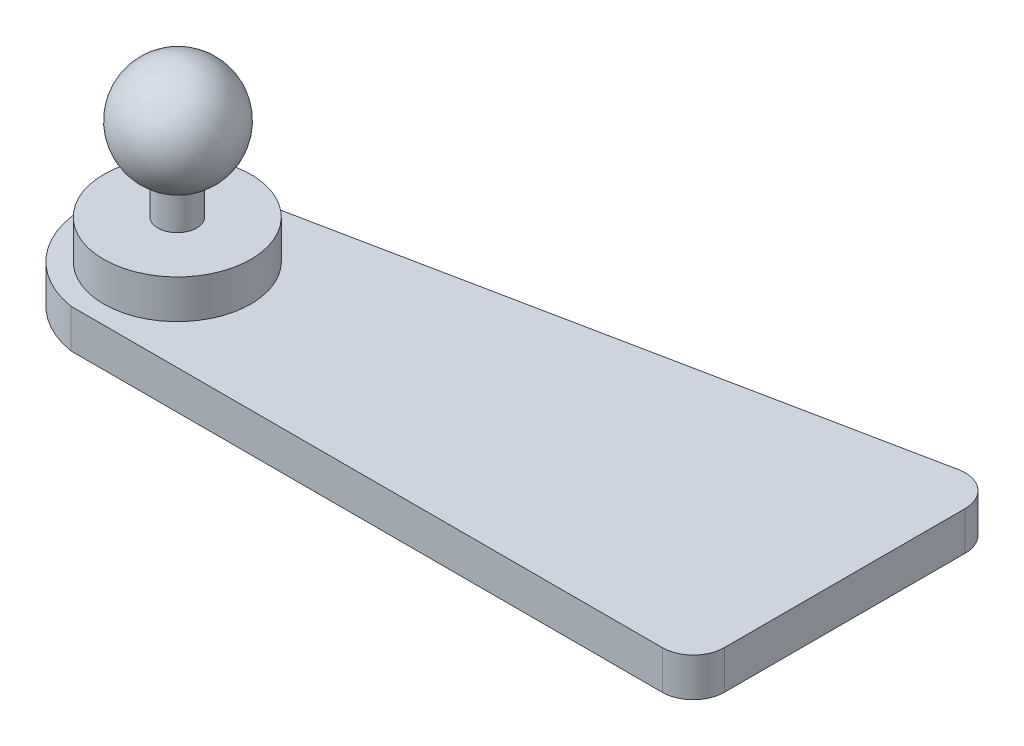
ISO-10303-21;
HEADER;
FILE_DESCRIPTION(('STEP AP214'),'2;1');
FILE_NAME('part.step','',(''),(''),'','','');
FILE_SCHEMA(('AUTOMOTIVE_DESIGN { 1 0 10303 214 1 1 1 1 }'));
ENDSEC;
DATA;
#1=APPLICATION_CONTEXT('core data for automotive mechanical design processes');
#2=APPLICATION_PROTOCOL_DEFINITION('international standard','automotive_design',2000,#1);
#3=PRODUCT_CONTEXT('',#1,'mechanical');
#4=PRODUCT('Part','Part','',(#3));
#5=PRODUCT_RELATED_PRODUCT_CATEGORY('part','',(#4));
#6=PRODUCT_DEFINITION_FORMATION('','',#4);
#7=PRODUCT_DEFINITION_CONTEXT('part definition',#1,'design');
#8=PRODUCT_DEFINITION('design','',#6,#7);
#9=PRODUCT_DEFINITION_SHAPE('','',#8);
#10=(LENGTH_UNIT() NAMED_UNIT(*) SI_UNIT(.MILLI.,.METRE.));
#11=(NAMED_UNIT(*) PLANE_ANGLE_UNIT() SI_UNIT($,.RADIAN.));
#12=(NAMED_UNIT(*) SI_UNIT($,.STERADIAN.) SOLID_ANGLE_UNIT());
#13=UNCERTAINTY_MEASURE_WITH_UNIT(LENGTH_MEASURE(1.E-05),#10,'distance_accuracy_value','');
#14=(GEOMETRIC_REPRESENTATION_CONTEXT(3) GLOBAL_UNCERTAINTY_ASSIGNED_CONTEXT((#13)) GLOBAL_UNIT_ASSIGNED_CONTEXT((#10,
#11,#12)) REPRESENTATION_CONTEXT('',''));
#15=CARTESIAN_POINT('',(0.,0.,0.));
#16=DIRECTION('',(0.,0.,1.));
#17=DIRECTION('',(1.,0.,0.));
#18=AXIS2_PLACEMENT_3D('',#15,#16,#17);
#19=CARTESIAN_POINT('',(51.0268301177277,3.175,0.));
#20=DIRECTION('',(-1.,0.,0.));
#21=DIRECTION('',(0.,0.,1.));
#22=AXIS2_PLACEMENT_3D('',#19,#20,#21);
#23=PLANE('',#22);
#24=DIRECTION('',(0.,0.,-1.));
#25=VECTOR('',#24,1.);
#26=CARTESIAN_POINT('',(51.0268301177277,0.,0.));
#27=LINE('',#26,#25);
#28=CARTESIAN_POINT('',(51.0268301177277,0.,-2.54));
#29=VERTEX_POINT('',#28);
#30=CARTESIAN_POINT('',(51.0268301177277,0.,-22.2936444696328));
#31=VERTEX_POINT('',#30);
#32=EDGE_CURVE('E131',#29,#31,#27,.T.);
#33=ORIENTED_EDGE('',*,*,#32,.T.);
#34=DIRECTION('',(0.,-1.,0.));
#35=VECTOR('',#34,1.);
#36=CARTESIAN_POINT('',(51.0268301177277,3.175,-22.2936444696328));
#37=LINE('',#36,#35);
#38=CARTESIAN_POINT('',(51.0268301177277,3.175,-22.2936444696328));
#39=VERTEX_POINT('',#38);
#40=EDGE_CURVE('E64',#31,#39,#37,.F.);
#41=ORIENTED_EDGE('',*,*,#40,.T.);
#42=DIRECTION('',(0.,0.,-1.));
#43=VECTOR('',#42,1.);
#44=CARTESIAN_POINT('',(51.0268301177277,3.175,0.));
#45=LINE('',#44,#43);
#46=CARTESIAN_POINT('',(51.0268301177277,3.175,-2.54));
#47=VERTEX_POINT('',#46);
#48=EDGE_CURVE('E108',#47,#39,#45,.T.);
#49=ORIENTED_EDGE('',*,*,#48,.F.);
#50=DIRECTION('',(0.,-1.,0.));
#51=VECTOR('',#50,1.);
#52=CARTESIAN_POINT('',(51.0268301177277,3.175,-2.54));
#53=LINE('',#52,#51);
#54=EDGE_CURVE('E224',#47,#29,#53,.T.);
#55=ORIENTED_EDGE('',*,*,#54,.T.);
#56=EDGE_LOOP('',(#33,#41,#49,#55));
#57=FACE_BOUND('',#56,.T.);
#58=ADVANCED_FACE('F42',(#57),#23,.F.);
#59=CARTESIAN_POINT('',(51.0268301177277,3.175,-25.4));
#60=DIRECTION('',(0.198611005955893,0.,0.980078399064681));
#61=DIRECTION('',(0.980078399064681,0.,-0.198611005955893));
#62=AXIS2_PLACEMENT_3D('',#59,#60,#61);
#63=PLANE('',#62);
#64=DIRECTION('',(-0.980078399064681,0.,0.198611005955893));
#65=VECTOR('',#64,1.);
#66=CARTESIAN_POINT('',(51.0268301177277,3.175,-25.4));
#67=LINE('',#66,#65);
#68=CARTESIAN_POINT('',(47.9823581625998,3.175,-24.7830436032571));
#69=VERTEX_POINT('',#68);
#70=CARTESIAN_POINT('',(-0.321385747656168,3.175,-14.9943826363311));
#71=VERTEX_POINT('',#70);
#72=EDGE_CURVE('E97',#69,#71,#67,.T.);
#73=ORIENTED_EDGE('',*,*,#72,.F.);
#74=DIRECTION('',(0.,-1.,0.));
#75=VECTOR('',#74,1.);
#76=CARTESIAN_POINT('',(47.9823581625998,3.175,-24.7830436032571));
#77=LINE('',#76,#75);
#78=CARTESIAN_POINT('',(47.9823581625998,0.,-24.7830436032571));
#79=VERTEX_POINT('',#78);
#80=EDGE_CURVE('E155',#69,#79,#77,.T.);
#81=ORIENTED_EDGE('',*,*,#80,.T.);
#82=DIRECTION('',(-0.980078399064681,0.,0.198611005955893));
#83=VECTOR('',#82,1.);
#84=CARTESIAN_POINT('',(51.0268301177277,0.,-25.4));
#85=LINE('',#84,#83);
#86=CARTESIAN_POINT('',(-0.321385747656168,0.,-14.9943826363311));
#87=VERTEX_POINT('',#86);
#88=EDGE_CURVE('E114',#79,#87,#85,.T.);
#89=ORIENTED_EDGE('',*,*,#88,.T.);
#90=DIRECTION('',(0.,-1.,0.));
#91=VECTOR('',#90,1.);
#92=CARTESIAN_POINT('',(-0.321385747656168,3.175,-14.9943826363311));
#93=LINE('',#92,#91);
#94=EDGE_CURVE('E111',#71,#87,#93,.T.);
#95=ORIENTED_EDGE('',*,*,#94,.F.);
#96=EDGE_LOOP('',(#73,#81,#89,#95));
#97=FACE_BOUND('',#96,.T.);
#98=ADVANCED_FACE('F112',(#97),#63,.F.);
#99=CARTESIAN_POINT('',(1.19203011772773,3.175,-7.52618523545827));
#100=DIRECTION('',(0.,-1.,0.));
#101=DIRECTION('',(0.,0.,-1.));
#102=AXIS2_PLACEMENT_3D('',#99,#100,#101);
#103=CYLINDRICAL_SURFACE('',#102,7.62);
#104=CARTESIAN_POINT('',(1.19203011772773,0.,-7.52618523545827));
#105=DIRECTION('',(0.,1.,0.));
#106=DIRECTION('',(0.,0.,1.));
#107=AXIS2_PLACEMENT_3D('',#104,#105,#106);
#108=CIRCLE('',#107,7.62);
#109=CARTESIAN_POINT('',(0.,0.,0.));
#110=VERTEX_POINT('',#109);
#111=EDGE_CURVE('E137',#87,#110,#108,.T.);
#112=ORIENTED_EDGE('',*,*,#111,.T.);
#113=DIRECTION('',(0.,-1.,0.));
#114=VECTOR('',#113,1.);
#115=CARTESIAN_POINT('',(0.,3.175,0.));
#116=LINE('',#115,#114);
#117=CARTESIAN_POINT('',(0.,3.175,0.));
#118=VERTEX_POINT('',#117);
#119=EDGE_CURVE('E119',#118,#110,#116,.T.);
#120=ORIENTED_EDGE('',*,*,#119,.F.);
#121=CARTESIAN_POINT('',(1.19203011772773,3.175,-7.52618523545827));
#122=DIRECTION('',(0.,1.,0.));
#123=DIRECTION('',(0.,0.,1.));
#124=AXIS2_PLACEMENT_3D('',#121,#122,#123);
#125=CIRCLE('',#124,7.62);
#126=EDGE_CURVE('E101',#71,#118,#125,.T.);
#127=ORIENTED_EDGE('',*,*,#126,.F.);
#128=ORIENTED_EDGE('',*,*,#94,.T.);
#129=EDGE_LOOP('',(#112,#120,#127,#128));
#130=FACE_BOUND('',#129,.T.);
#131=ADVANCED_FACE('F121',(#130),#103,.T.);
#132=CARTESIAN_POINT('',(0.,3.175,0.));
#133=DIRECTION('',(0.,0.,-1.));
#134=DIRECTION('',(-1.,0.,0.));
#135=AXIS2_PLACEMENT_3D('',#132,#133,#134);
#136=PLANE('',#135);
#137=DIRECTION('',(1.,0.,0.));
#138=VECTOR('',#137,1.);
#139=CARTESIAN_POINT('',(0.,0.,0.));
#140=LINE('',#139,#138);
#141=CARTESIAN_POINT('',(48.4868301177277,0.,0.));
#142=VERTEX_POINT('',#141);
#143=EDGE_CURVE('E140',#110,#142,#140,.T.);
#144=ORIENTED_EDGE('',*,*,#143,.T.);
#145=DIRECTION('',(0.,-1.,0.));
#146=VECTOR('',#145,1.);
#147=CARTESIAN_POINT('',(48.4868301177277,3.175,0.));
#148=LINE('',#147,#146);
#149=CARTESIAN_POINT('',(48.4868301177277,3.175,0.));
#150=VERTEX_POINT('',#149);
#151=EDGE_CURVE('E11',#142,#150,#148,.F.);
#152=ORIENTED_EDGE('',*,*,#151,.T.);
#153=DIRECTION('',(1.,0.,0.));
#154=VECTOR('',#153,1.);
#155=CARTESIAN_POINT('',(0.,3.175,0.));
#156=LINE('',#155,#154);
#157=EDGE_CURVE('E124',#118,#150,#156,.T.);
#158=ORIENTED_EDGE('',*,*,#157,.F.);
#159=ORIENTED_EDGE('',*,*,#119,.T.);
#160=EDGE_LOOP('',(#144,#152,#158,#159));
#161=FACE_BOUND('',#160,.T.);
#162=ADVANCED_FACE('F182',(#161),#136,.F.);
#163=CARTESIAN_POINT('',(1.19203011772773,3.175,-7.52618523545827));
#164=DIRECTION('',(0.,1.,0.));
#165=DIRECTION('',(0.,0.,1.));
#166=AXIS2_PLACEMENT_3D('',#163,#164,#165);
#167=PLANE('',#166);
#168=CARTESIAN_POINT('',(1.19203011772773,3.175,-7.52618523545827));
#169=DIRECTION('',(0.,1.,0.));
#170=DIRECTION('',(0.,0.,1.));
#171=AXIS2_PLACEMENT_3D('',#168,#169,#170);
#172=CIRCLE('',#171,6.0325);
#173=CARTESIAN_POINT('',(1.19203011772773,3.175,-1.49368523545827));
#174=VERTEX_POINT('',#173);
#175=EDGE_CURVE('E154',#174,#174,#172,.T.);
#176=ORIENTED_EDGE('',*,*,#175,.F.);
#177=EDGE_LOOP('',(#176));
#178=FACE_BOUND('',#177,.T.);
#179=ORIENTED_EDGE('',*,*,#48,.T.);
#180=CARTESIAN_POINT('',(48.4868301177277,3.175,-22.2936444696328));
#181=DIRECTION('',(0.,1.,0.));
#182=DIRECTION('',(0.,0.,1.));
#183=AXIS2_PLACEMENT_3D('',#180,#181,#182);
#184=CIRCLE('',#183,2.54);
#185=EDGE_CURVE('E51',#39,#69,#184,.T.);
#186=ORIENTED_EDGE('',*,*,#185,.T.);
#187=ORIENTED_EDGE('',*,*,#72,.T.);
#188=ORIENTED_EDGE('',*,*,#126,.T.);
#189=ORIENTED_EDGE('',*,*,#157,.T.);
#190=CARTESIAN_POINT('',(48.4868301177277,3.175,-2.54));
#191=DIRECTION('',(0.,1.,0.));
#192=DIRECTION('',(0.,0.,1.));
#193=AXIS2_PLACEMENT_3D('',#190,#191,#192);
#194=CIRCLE('',#193,2.54);
#195=EDGE_CURVE('E214',#150,#47,#194,.T.);
#196=ORIENTED_EDGE('',*,*,#195,.T.);
#197=EDGE_LOOP('',(#179,#186,#187,#188,#189,#196));
#198=FACE_BOUND('',#197,.T.);
#199=ADVANCED_FACE('F99',(#178,#198),#167,.T.);
#200=CARTESIAN_POINT('',(1.19203011772773,0.,-7.52618523545827));
#201=DIRECTION('',(0.,1.,0.));
#202=DIRECTION('',(0.,0.,1.));
#203=AXIS2_PLACEMENT_3D('',#200,#201,#202);
#204=PLANE('',#203);
#205=ORIENTED_EDGE('',*,*,#88,.F.);
#206=CARTESIAN_POINT('',(48.4868301177277,0.,-22.2936444696328));
#207=DIRECTION('',(0.,1.,0.));
#208=DIRECTION('',(0.,0.,1.));
#209=AXIS2_PLACEMENT_3D('',#206,#207,#208);
#210=CIRCLE('',#209,2.54);
#211=EDGE_CURVE('E227',#79,#31,#210,.F.);
#212=ORIENTED_EDGE('',*,*,#211,.T.);
#213=ORIENTED_EDGE('',*,*,#32,.F.);
#214=CARTESIAN_POINT('',(48.4868301177277,0.,-2.54));
#215=DIRECTION('',(0.,1.,0.));
#216=DIRECTION('',(0.,0.,1.));
#217=AXIS2_PLACEMENT_3D('',#214,#215,#216);
#218=CIRCLE('',#217,2.54);
#219=EDGE_CURVE('E229',#29,#142,#218,.F.);
#220=ORIENTED_EDGE('',*,*,#219,.T.);
#221=ORIENTED_EDGE('',*,*,#143,.F.);
#222=ORIENTED_EDGE('',*,*,#111,.F.);
#223=EDGE_LOOP('',(#205,#212,#213,#220,#221,#222));
#224=FACE_BOUND('',#223,.T.);
#225=ADVANCED_FACE('F185',(#224),#204,.F.);
#226=CARTESIAN_POINT('',(1.19203011772773,6.35,-7.52618523545827));
#227=DIRECTION('',(0.,-1.,0.));
#228=DIRECTION('',(0.,0.,-1.));
#229=AXIS2_PLACEMENT_3D('',#226,#227,#228);
#230=CYLINDRICAL_SURFACE('',#229,6.0325);
#231=CARTESIAN_POINT('',(1.19203011772773,6.35,-7.52618523545827));
#232=DIRECTION('',(0.,1.,0.));
#233=DIRECTION('',(0.,0.,1.));
#234=AXIS2_PLACEMENT_3D('',#231,#232,#233);
#235=CIRCLE('',#234,6.0325);
#236=CARTESIAN_POINT('',(1.19203011772773,6.35,-1.49368523545827));
#237=VERTEX_POINT('',#236);
#238=EDGE_CURVE('E134',#237,#237,#235,.T.);
#239=ORIENTED_EDGE('',*,*,#238,.F.);
#240=EDGE_LOOP('',(#239));
#241=FACE_BOUND('',#240,.T.);
#242=ORIENTED_EDGE('',*,*,#175,.T.);
#243=EDGE_LOOP('',(#242));
#244=FACE_BOUND('',#243,.T.);
#245=ADVANCED_FACE('F188',(#241,#244),#230,.T.);
#246=CARTESIAN_POINT('',(1.19203011772773,6.35,-7.52618523545827));
#247=DIRECTION('',(0.,1.,0.));
#248=DIRECTION('',(0.,0.,1.));
#249=AXIS2_PLACEMENT_3D('',#246,#247,#248);
#250=PLANE('',#249);
#251=CARTESIAN_POINT('',(1.19203011772773,6.35,-7.52618523545827));
#252=DIRECTION('',(0.,1.,0.));
#253=DIRECTION('',(0.,0.,1.));
#254=AXIS2_PLACEMENT_3D('',#251,#252,#253);
#255=CIRCLE('',#254,1.5875);
#256=CARTESIAN_POINT('',(1.19203011772773,6.35,-5.93868523545827));
#257=VERTEX_POINT('',#256);
#258=EDGE_CURVE('E118',#257,#257,#255,.T.);
#259=ORIENTED_EDGE('',*,*,#258,.F.);
#260=EDGE_LOOP('',(#259));
#261=FACE_BOUND('',#260,.T.);
#262=ORIENTED_EDGE('',*,*,#238,.T.);
#263=EDGE_LOOP('',(#262));
#264=FACE_BOUND('',#263,.T.);
#265=ADVANCED_FACE('F170',(#261,#264),#250,.T.);
#266=CARTESIAN_POINT('',(1.19203011772773,9.525,-7.52618523545827));
#267=DIRECTION('',(0.,-1.,0.));
#268=DIRECTION('',(0.,0.,-1.));
#269=AXIS2_PLACEMENT_3D('',#266,#267,#268);
#270=CYLINDRICAL_SURFACE('',#269,1.5875);
#271=CARTESIAN_POINT('',(0.0695117122072861,9.20935120803805,-8.6487308600413));
#272=CARTESIAN_POINT('',(0.132573222227126,9.20842182206116,-8.71178524589839));
#273=CARTESIAN_POINT('',(0.201005481028152,9.20741360783786,-8.76955910963699));
#274=CARTESIAN_POINT('',(0.346655497386279,9.20526866487926,-8.87284278985769));
#275=CARTESIAN_POINT('',(0.423883748069611,9.20413178266068,-8.91833773569041));
#276=CARTESIAN_POINT('',(0.584852140681161,9.20176326008726,-8.99569448090655));
#277=CARTESIAN_POINT('',(0.668589131343414,9.20053166559125,-9.02756282973963));
#278=CARTESIAN_POINT('',(0.840201230818812,9.19800884534296,-9.07677874994324));
#279=CARTESIAN_POINT('',(0.928075305923664,9.19671763448819,-9.09412992850508));
#280=CARTESIAN_POINT('',(1.10550393281583,9.1941118127683,-9.11383685230457));
#281=CARTESIAN_POINT('',(1.19505875777942,9.19279719810113,-9.11619013835535));
#282=CARTESIAN_POINT('',(1.37329586491983,9.19018206082408,-9.10582709187896));
#283=CARTESIAN_POINT('',(1.46197811245895,9.18888153877342,-9.09311016354066));
#284=CARTESIAN_POINT('',(1.63594967727448,9.18633145186526,-9.05296651756277));
#285=CARTESIAN_POINT('',(1.72123897475196,9.1850818873051,-9.02553971409994));
#286=CARTESIAN_POINT('',(1.88600247678775,9.18266901176605,-8.95675442691769));
#287=CARTESIAN_POINT('',(1.96547669388269,9.18150570060119,-8.91539597323431));
#288=CARTESIAN_POINT('',(2.11635036108078,9.17929813984302,-8.81992302991174));
#289=CARTESIAN_POINT('',(2.18775015587552,9.17825388516724,-8.7658090851002));
#290=CARTESIAN_POINT('',(2.32045115113841,9.17631372616568,-8.64636004420195));
#291=CARTESIAN_POINT('',(2.38175237449459,9.17541782150367,-8.58102497354819));
#292=CARTESIAN_POINT('',(2.49251003267983,9.17379955969912,-8.44099474127826));
#293=CARTESIAN_POINT('',(2.54196757233407,9.17307718636888,-8.36630045371741));
#294=CARTESIAN_POINT('',(2.62764047273675,9.17182610282168,-8.20966720817419));
#295=CARTESIAN_POINT('',(2.6638558271202,9.17129739269779,-8.1277282467096));
#296=CARTESIAN_POINT('',(2.72201246648981,9.1704484618988,-7.95894072177921));
#297=CARTESIAN_POINT('',(2.74395520836845,9.17012821994406,-7.8720926603991));
#298=CARTESIAN_POINT('',(2.77294917253312,9.16970508612815,-7.69594491276859));
#299=CARTESIAN_POINT('',(2.78000040741887,9.16960219408308,-7.60664522859257));
#300=CARTESIAN_POINT('',(2.77901110285954,9.16961663075636,-7.42813540054804));
#301=CARTESIAN_POINT('',(2.77097155357907,9.16973394502611,-7.33892525118907));
#302=CARTESIAN_POINT('',(2.74003100729113,9.17018549180162,-7.16312104841577));
#303=CARTESIAN_POINT('',(2.71713001005783,9.17051972431067,-7.07652699504119));
#304=CARTESIAN_POINT('',(2.65711708417014,9.17139577031765,-6.90841312703555));
#305=CARTESIAN_POINT('',(2.62000517615404,9.17193758351411,-6.82689330503547));
#306=CARTESIAN_POINT('',(2.53262439873269,9.17321364642877,-6.6712414010239));
#307=CARTESIAN_POINT('',(2.48235552650598,9.17394789618825,-6.59710932059669));
#308=CARTESIAN_POINT('',(2.3700846000775,9.17558833295084,-6.45833207969495));
#309=CARTESIAN_POINT('',(2.30808180066505,9.17649453087425,-6.39368752222728));
#310=CARTESIAN_POINT('',(2.17410548391069,9.1784534281739,-6.27572514676537));
#311=CARTESIAN_POINT('',(2.10213196089925,9.17950612763345,-6.22240733521175));
#312=CARTESIAN_POINT('',(1.95024954374463,9.18172856709439,-6.1286062279908));
#313=CARTESIAN_POINT('',(1.87033984767058,9.18289831892371,-6.08812423108752));
#314=CARTESIAN_POINT('',(1.70485951834704,9.18532183329972,-6.02115049357072));
#315=CARTESIAN_POINT('',(1.61928888265765,9.1865755958826,-5.99465875898717));
#316=CARTESIAN_POINT('',(1.44490705345577,9.18913185371229,-5.95641513972591));
#317=CARTESIAN_POINT('',(1.35609555359732,9.19043435356633,-5.94466465221296));
#318=CARTESIAN_POINT('',(1.17776051683099,9.19305109258443,-5.93624145538104));
#319=CARTESIAN_POINT('',(1.08823697938223,9.1943653317574,-5.93956875751677));
#320=CARTESIAN_POINT('',(0.911014736276955,9.19696828559749,-5.9612072910304));
#321=CARTESIAN_POINT('',(0.82331611755547,9.19825699904848,-5.97951923457488));
#322=CARTESIAN_POINT('',(0.652237821079395,9.20077212541096,-6.03060842738683));
#323=CARTESIAN_POINT('',(0.56885813872046,9.20199853838887,-6.06338566123273));
#324=CARTESIAN_POINT('',(0.4087866584172,9.20435399836879,-6.14247455766199));
#325=CARTESIAN_POINT('',(0.332094713296752,9.20548304751348,-6.18878592230393));
#326=CARTESIAN_POINT('',(0.187574223330808,9.20761146530448,-6.29362927957487));
#327=CARTESIAN_POINT('',(0.119745691143525,9.20861083376558,-6.35216128965639));
#328=CARTESIAN_POINT('',(-0.00511618963438644,9.21045110259413,-6.47977923553468));
#329=CARTESIAN_POINT('',(-0.0621504388424368,9.21129201618217,-6.54886428997177));
#330=CARTESIAN_POINT('',(-0.163810925214603,9.21279127406261,-6.69563111610258));
#331=CARTESIAN_POINT('',(-0.208437144570726,9.21344961809298,-6.77331290013409));
#332=CARTESIAN_POINT('',(-0.284010400717592,9.21456469778881,-6.93506055167361));
#333=CARTESIAN_POINT('',(-0.314958630787561,9.21502145104122,-7.01912586152737));
#334=CARTESIAN_POINT('',(-0.362301326669214,9.21572022878832,-7.19125667806727));
#335=CARTESIAN_POINT('',(-0.378696371572541,9.21596226182702,-7.27932202543972));
#336=CARTESIAN_POINT('',(-0.396467883391215,9.21622461691624,-7.45693830762784));
#337=CARTESIAN_POINT('',(-0.397847173480786,9.21624498064372,-7.54648896001408));
#338=CARTESIAN_POINT('',(-0.385551845355314,9.21606346603642,-7.72457506874698));
#339=CARTESIAN_POINT('',(-0.37187348833079,9.2158615325053,-7.81311026744035));
#340=CARTESIAN_POINT('',(-0.32984326749769,9.21524113873632,-7.98665927023288));
#341=CARTESIAN_POINT('',(-0.301484747537831,9.21482258027828,-8.07167145805862));
#342=CARTESIAN_POINT('',(-0.230911899572185,9.21378120465903,-8.23565091804196));
#343=CARTESIAN_POINT('',(-0.188714280185701,9.21315863381264,-8.31462533880067));
#344=CARTESIAN_POINT('',(-0.109945871518259,9.21199686429668,-8.4361991890376));
#345=CARTESIAN_POINT('',(-0.0772052822606031,9.21151404178511,-8.48132799565577));
#346=CARTESIAN_POINT('',(-0.00717100828344767,9.2104814669139,-8.56790153816716));
#347=CARTESIAN_POINT('',(0.0301226764062071,9.20993171455471,-8.60934627408452));
#348=CARTESIAN_POINT('',(0.0695117122072861,9.20935120803805,-8.6487308600413));
#349=B_SPLINE_CURVE_WITH_KNOTS('',3,(#271,#272,#273,#274,#275,#276,#277,#278,#279,#280,#281,
#282,#283,#284,#285,#286,#287,#288,#289,#290,#291,#292,#293,#294,#295,#296,#297,#298,#299,#300,
#301,#302,#303,#304,#305,#306,#307,#308,#309,#310,#311,#312,#313,#314,#315,#316,#317,#318,#319,
#320,#321,#322,#323,#324,#325,#326,#327,#328,#329,#330,#331,#332,#333,#334,#335,#336,#337,#338,
#339,#340,#341,#342,#343,#344,#345,#346,#347,#348),.UNSPECIFIED.,.T.,.F.,(4,2,2,2,2,2,2,2,2,2,2,
2,2,2,2,2,2,2,2,2,2,2,2,2,2,2,2,2,2,2,2,2,2,2,2,2,2,2,4),(0.,0.267343398034948,
0.535009129871523,0.802546066589395,1.07001650661779,1.33753080233295,1.6050556747598,
1.87258210804979,2.14010796456821,2.40762239627557,2.67513622166321,2.94262508258469,
3.21011407207751,3.47757575305355,3.74503720772989,4.01248111384096,4.27992502401604,
4.54736854578796,4.81481212491214,5.08227269482978,5.34973341683062,5.61722119263427,
5.8847090837281,6.15222232521612,6.41973576993598,6.68726192935466,6.95478780356238,
7.2223077888781,7.48982815624617,7.75732619329162,8.02482461424804,8.2922996938097,
8.55976412968572,8.82717827759723,9.09465883934501,9.36226078615716,9.62954082624808,
9.79652697583588,9.96351312432912),.UNSPECIFIED.);
#350=CARTESIAN_POINT('',(0.0695117122072861,9.20935120803805,-8.6487308600413));
#351=VERTEX_POINT('',#350);
#352=EDGE_CURVE('E145',#351,#351,#349,.T.);
#353=ORIENTED_EDGE('',*,*,#352,.T.);
#354=EDGE_LOOP('',(#353));
#355=FACE_BOUND('',#354,.T.);
#356=ORIENTED_EDGE('',*,*,#258,.T.);
#357=EDGE_LOOP('',(#356));
#358=FACE_BOUND('',#357,.T.);
#359=ADVANCED_FACE('F157',(#355,#358),#270,.T.);
#360=CARTESIAN_POINT('',(1.25096131302509,13.208,-7.52618523545827));
#361=DIRECTION('',(0.,1.,0.));
#362=DIRECTION('',(1.,0.,0.));
#363=AXIS2_PLACEMENT_3D('',#360,#361,#362);
#364=SPHERICAL_SURFACE('',#363,4.318);
#365=ORIENTED_EDGE('',*,*,#352,.F.);
#366=EDGE_LOOP('',(#365));
#367=FACE_BOUND('',#366,.T.);
#368=ADVANCED_FACE('F160',(#367),#364,.T.);
#369=CARTESIAN_POINT('',(48.4868301177277,3.175,-22.2936444696328));
#370=DIRECTION('',(0.,-1.,0.));
#371=DIRECTION('',(0.,0.,-1.));
#372=AXIS2_PLACEMENT_3D('',#369,#370,#371);
#373=CYLINDRICAL_SURFACE('',#372,2.54);
#374=ORIENTED_EDGE('',*,*,#185,.F.);
#375=ORIENTED_EDGE('',*,*,#40,.F.);
#376=ORIENTED_EDGE('',*,*,#211,.F.);
#377=ORIENTED_EDGE('',*,*,#80,.F.);
#378=EDGE_LOOP('',(#374,#375,#376,#377));
#379=FACE_BOUND('',#378,.T.);
#380=ADVANCED_FACE('F163',(#379),#373,.T.);
#381=CARTESIAN_POINT('',(48.4868301177277,3.175,-2.54));
#382=DIRECTION('',(0.,-1.,0.));
#383=DIRECTION('',(0.,0.,-1.));
#384=AXIS2_PLACEMENT_3D('',#381,#382,#383);
#385=CYLINDRICAL_SURFACE('',#384,2.54);
#386=ORIENTED_EDGE('',*,*,#195,.F.);
#387=ORIENTED_EDGE('',*,*,#151,.F.);
#388=ORIENTED_EDGE('',*,*,#219,.F.);
#389=ORIENTED_EDGE('',*,*,#54,.F.);
#390=EDGE_LOOP('',(#386,#387,#388,#389));
#391=FACE_BOUND('',#390,.T.);
#392=ADVANCED_FACE('F44',(#391),#385,.T.);
#393=CLOSED_SHELL('',(#58,#98,#131,#162,#199,#225,#245,#265,#359,#368,#380,#392));
#394=MANIFOLD_SOLID_BREP('B2',#393);
#395=ADVANCED_BREP_SHAPE_REPRESENTATION('',(#18,#394),#14);
#396=SHAPE_DEFINITION_REPRESENTATION(#9,#395);
ENDSEC;
END-ISO-10303-21;
